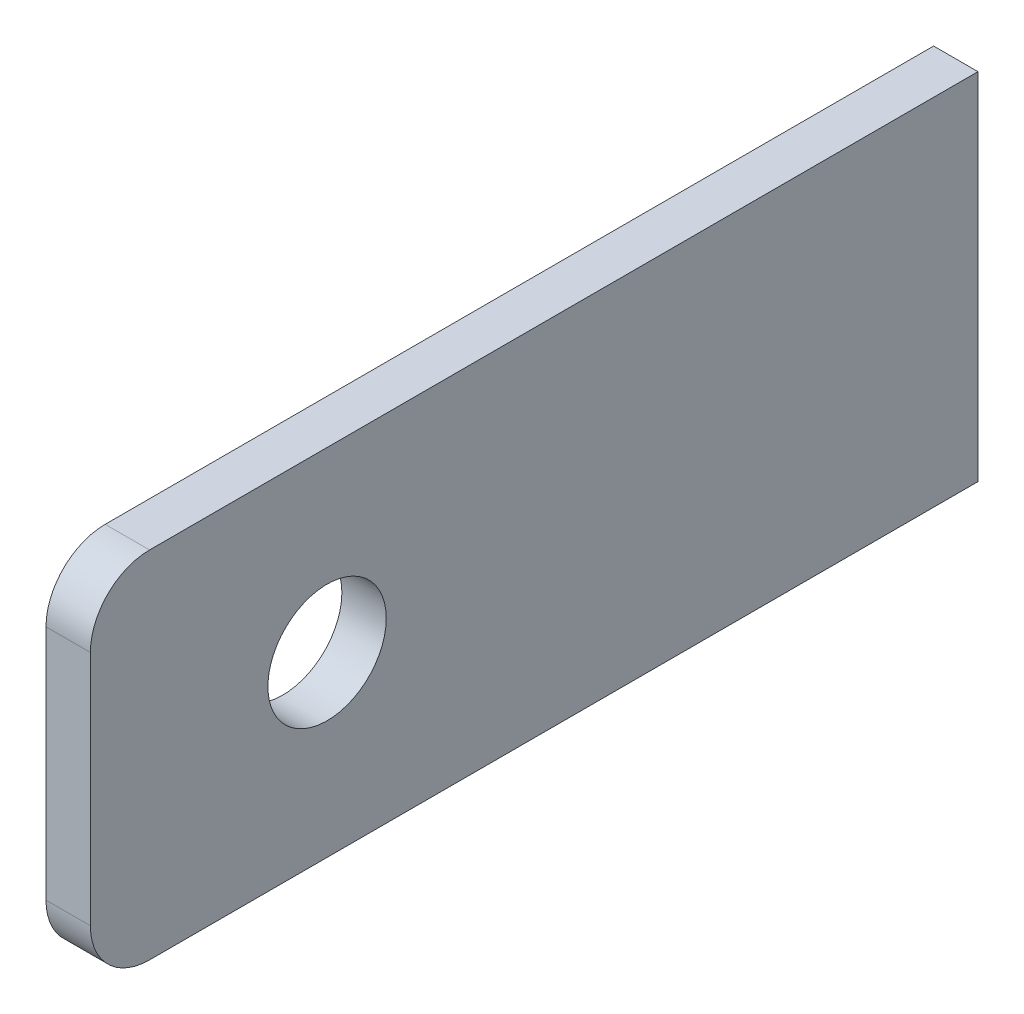
ISO-10303-21;
HEADER;
FILE_DESCRIPTION(('STEP AP214'),'2;1');
FILE_NAME('part.step','',(''),(''),'','','');
FILE_SCHEMA(('AUTOMOTIVE_DESIGN { 1 0 10303 214 1 1 1 1 }'));
ENDSEC;
DATA;
#1=APPLICATION_CONTEXT('core data for automotive mechanical design processes');
#2=APPLICATION_PROTOCOL_DEFINITION('international standard','automotive_design',2000,#1);
#3=PRODUCT_CONTEXT('',#1,'mechanical');
#4=PRODUCT('Part','Part','',(#3));
#5=PRODUCT_RELATED_PRODUCT_CATEGORY('part','',(#4));
#6=PRODUCT_DEFINITION_FORMATION('','',#4);
#7=PRODUCT_DEFINITION_CONTEXT('part definition',#1,'design');
#8=PRODUCT_DEFINITION('design','',#6,#7);
#9=PRODUCT_DEFINITION_SHAPE('','',#8);
#10=(LENGTH_UNIT() NAMED_UNIT(*) SI_UNIT(.MILLI.,.METRE.));
#11=(NAMED_UNIT(*) PLANE_ANGLE_UNIT() SI_UNIT($,.RADIAN.));
#12=(NAMED_UNIT(*) SI_UNIT($,.STERADIAN.) SOLID_ANGLE_UNIT());
#13=UNCERTAINTY_MEASURE_WITH_UNIT(LENGTH_MEASURE(1.E-05),#10,'distance_accuracy_value','');
#14=(GEOMETRIC_REPRESENTATION_CONTEXT(3) GLOBAL_UNCERTAINTY_ASSIGNED_CONTEXT((#13)) GLOBAL_UNIT_ASSIGNED_CONTEXT((#10,
#11,#12)) REPRESENTATION_CONTEXT('',''));
#15=CARTESIAN_POINT('',(0.,0.,0.));
#16=DIRECTION('',(0.,0.,1.));
#17=DIRECTION('',(1.,0.,0.));
#18=AXIS2_PLACEMENT_3D('',#15,#16,#17);
#19=CARTESIAN_POINT('',(7.5,60.,-150.));
#20=DIRECTION('',(0.,0.,1.));
#21=DIRECTION('',(1.,0.,0.));
#22=AXIS2_PLACEMENT_3D('',#19,#20,#21);
#23=PLANE('',#22);
#24=DIRECTION('',(0.,1.,0.));
#25=VECTOR('',#24,1.);
#26=CARTESIAN_POINT('',(-7.5,60.,-150.));
#27=LINE('',#26,#25);
#28=CARTESIAN_POINT('',(-7.5,-60.,-150.));
#29=VERTEX_POINT('',#28);
#30=CARTESIAN_POINT('',(-7.5,60.,-150.));
#31=VERTEX_POINT('',#30);
#32=EDGE_CURVE('E93',#29,#31,#27,.T.);
#33=ORIENTED_EDGE('',*,*,#32,.T.);
#34=DIRECTION('',(-1.,0.,0.));
#35=VECTOR('',#34,1.);
#36=CARTESIAN_POINT('',(7.5,60.,-150.));
#37=LINE('',#36,#35);
#38=CARTESIAN_POINT('',(7.5,60.,-150.));
#39=VERTEX_POINT('',#38);
#40=EDGE_CURVE('E74',#39,#31,#37,.T.);
#41=ORIENTED_EDGE('',*,*,#40,.F.);
#42=DIRECTION('',(0.,1.,0.));
#43=VECTOR('',#42,1.);
#44=CARTESIAN_POINT('',(7.5,60.,-150.));
#45=LINE('',#44,#43);
#46=CARTESIAN_POINT('',(7.5,-60.,-150.));
#47=VERTEX_POINT('',#46);
#48=EDGE_CURVE('E80',#47,#39,#45,.T.);
#49=ORIENTED_EDGE('',*,*,#48,.F.);
#50=DIRECTION('',(-1.,0.,0.));
#51=VECTOR('',#50,1.);
#52=CARTESIAN_POINT('',(7.5,-60.,-150.));
#53=LINE('',#52,#51);
#54=EDGE_CURVE('E96',#47,#29,#53,.T.);
#55=ORIENTED_EDGE('',*,*,#54,.T.);
#56=EDGE_LOOP('',(#33,#41,#49,#55));
#57=FACE_BOUND('',#56,.T.);
#58=ADVANCED_FACE('F17',(#57),#23,.F.);
#59=CARTESIAN_POINT('',(7.5,60.,150.));
#60=DIRECTION('',(0.,-1.,0.));
#61=DIRECTION('',(0.,0.,-1.));
#62=AXIS2_PLACEMENT_3D('',#59,#60,#61);
#63=PLANE('',#62);
#64=DIRECTION('',(0.,0.,1.));
#65=VECTOR('',#64,1.);
#66=CARTESIAN_POINT('',(-7.5,60.,150.));
#67=LINE('',#66,#65);
#68=CARTESIAN_POINT('',(-7.5,60.,130.));
#69=VERTEX_POINT('',#68);
#70=EDGE_CURVE('E134',#31,#69,#67,.T.);
#71=ORIENTED_EDGE('',*,*,#70,.T.);
#72=DIRECTION('',(-1.,0.,0.));
#73=VECTOR('',#72,1.);
#74=CARTESIAN_POINT('',(7.5,60.,130.));
#75=LINE('',#74,#73);
#76=CARTESIAN_POINT('',(7.5,60.,130.));
#77=VERTEX_POINT('',#76);
#78=EDGE_CURVE('E11',#69,#77,#75,.F.);
#79=ORIENTED_EDGE('',*,*,#78,.T.);
#80=DIRECTION('',(0.,0.,1.));
#81=VECTOR('',#80,1.);
#82=CARTESIAN_POINT('',(7.5,60.,150.));
#83=LINE('',#82,#81);
#84=EDGE_CURVE('E70',#39,#77,#83,.T.);
#85=ORIENTED_EDGE('',*,*,#84,.F.);
#86=ORIENTED_EDGE('',*,*,#40,.T.);
#87=EDGE_LOOP('',(#71,#79,#85,#86));
#88=FACE_BOUND('',#87,.T.);
#89=ADVANCED_FACE('F72',(#88),#63,.F.);
#90=CARTESIAN_POINT('',(7.5,60.,150.));
#91=DIRECTION('',(0.,0.,-1.));
#92=DIRECTION('',(0.,1.,0.));
#93=AXIS2_PLACEMENT_3D('',#90,#91,#92);
#94=PLANE('',#93);
#95=DIRECTION('',(0.,-1.,0.));
#96=VECTOR('',#95,1.);
#97=CARTESIAN_POINT('',(-7.5,60.,150.));
#98=LINE('',#97,#96);
#99=CARTESIAN_POINT('',(-7.5,40.,150.));
#100=VERTEX_POINT('',#99);
#101=CARTESIAN_POINT('',(-7.5,-40.,150.));
#102=VERTEX_POINT('',#101);
#103=EDGE_CURVE('E130',#100,#102,#98,.T.);
#104=ORIENTED_EDGE('',*,*,#103,.T.);
#105=DIRECTION('',(-1.,0.,0.));
#106=VECTOR('',#105,1.);
#107=CARTESIAN_POINT('',(7.5,-40.,150.));
#108=LINE('',#107,#106);
#109=CARTESIAN_POINT('',(7.5,-40.,150.));
#110=VERTEX_POINT('',#109);
#111=EDGE_CURVE('E39',#102,#110,#108,.F.);
#112=ORIENTED_EDGE('',*,*,#111,.T.);
#113=DIRECTION('',(0.,-1.,0.));
#114=VECTOR('',#113,1.);
#115=CARTESIAN_POINT('',(7.5,60.,150.));
#116=LINE('',#115,#114);
#117=CARTESIAN_POINT('',(7.5,40.,150.));
#118=VERTEX_POINT('',#117);
#119=EDGE_CURVE('E79',#118,#110,#116,.T.);
#120=ORIENTED_EDGE('',*,*,#119,.F.);
#121=DIRECTION('',(-1.,0.,0.));
#122=VECTOR('',#121,1.);
#123=CARTESIAN_POINT('',(7.5,40.,150.));
#124=LINE('',#123,#122);
#125=EDGE_CURVE('E112',#118,#100,#124,.T.);
#126=ORIENTED_EDGE('',*,*,#125,.T.);
#127=EDGE_LOOP('',(#104,#112,#120,#126));
#128=FACE_BOUND('',#127,.T.);
#129=ADVANCED_FACE('F131',(#128),#94,.F.);
#130=CARTESIAN_POINT('',(7.5,-60.,150.));
#131=DIRECTION('',(0.,1.,0.));
#132=DIRECTION('',(0.,0.,1.));
#133=AXIS2_PLACEMENT_3D('',#130,#131,#132);
#134=PLANE('',#133);
#135=DIRECTION('',(0.,0.,-1.));
#136=VECTOR('',#135,1.);
#137=CARTESIAN_POINT('',(7.5,-60.,150.));
#138=LINE('',#137,#136);
#139=CARTESIAN_POINT('',(7.5,-60.,130.));
#140=VERTEX_POINT('',#139);
#141=EDGE_CURVE('E85',#140,#47,#138,.T.);
#142=ORIENTED_EDGE('',*,*,#141,.F.);
#143=DIRECTION('',(-1.,0.,0.));
#144=VECTOR('',#143,1.);
#145=CARTESIAN_POINT('',(7.5,-60.,130.));
#146=LINE('',#145,#144);
#147=CARTESIAN_POINT('',(-7.5,-60.,130.));
#148=VERTEX_POINT('',#147);
#149=EDGE_CURVE('E95',#140,#148,#146,.T.);
#150=ORIENTED_EDGE('',*,*,#149,.T.);
#151=DIRECTION('',(0.,0.,-1.));
#152=VECTOR('',#151,1.);
#153=CARTESIAN_POINT('',(-7.5,-60.,150.));
#154=LINE('',#153,#152);
#155=EDGE_CURVE('E90',#148,#29,#154,.T.);
#156=ORIENTED_EDGE('',*,*,#155,.T.);
#157=ORIENTED_EDGE('',*,*,#54,.F.);
#158=EDGE_LOOP('',(#142,#150,#156,#157));
#159=FACE_BOUND('',#158,.T.);
#160=ADVANCED_FACE('F122',(#159),#134,.F.);
#161=CARTESIAN_POINT('',(7.5,0.,0.));
#162=DIRECTION('',(1.,0.,0.));
#163=DIRECTION('',(0.,0.,-1.));
#164=AXIS2_PLACEMENT_3D('',#161,#162,#163);
#165=PLANE('',#164);
#166=CARTESIAN_POINT('',(7.5,0.,70.));
#167=DIRECTION('',(1.,0.,0.));
#168=DIRECTION('',(0.,0.,-1.));
#169=AXIS2_PLACEMENT_3D('',#166,#167,#168);
#170=CIRCLE('',#169,20.);
#171=CARTESIAN_POINT('',(7.5,0.,50.));
#172=VERTEX_POINT('',#171);
#173=EDGE_CURVE('E144',#172,#172,#170,.T.);
#174=ORIENTED_EDGE('',*,*,#173,.F.);
#175=EDGE_LOOP('',(#174));
#176=FACE_BOUND('',#175,.T.);
#177=ORIENTED_EDGE('',*,*,#119,.T.);
#178=CARTESIAN_POINT('',(7.5,-40.,130.));
#179=DIRECTION('',(1.,0.,0.));
#180=DIRECTION('',(0.,0.,-1.));
#181=AXIS2_PLACEMENT_3D('',#178,#179,#180);
#182=CIRCLE('',#181,20.);
#183=EDGE_CURVE('E26',#110,#140,#182,.T.);
#184=ORIENTED_EDGE('',*,*,#183,.T.);
#185=ORIENTED_EDGE('',*,*,#141,.T.);
#186=ORIENTED_EDGE('',*,*,#48,.T.);
#187=ORIENTED_EDGE('',*,*,#84,.T.);
#188=CARTESIAN_POINT('',(7.5,40.,130.));
#189=DIRECTION('',(1.,0.,0.));
#190=DIRECTION('',(0.,0.,-1.));
#191=AXIS2_PLACEMENT_3D('',#188,#189,#190);
#192=CIRCLE('',#191,20.);
#193=EDGE_CURVE('E116',#77,#118,#192,.T.);
#194=ORIENTED_EDGE('',*,*,#193,.T.);
#195=EDGE_LOOP('',(#177,#184,#185,#186,#187,#194));
#196=FACE_BOUND('',#195,.T.);
#197=ADVANCED_FACE('F83',(#176,#196),#165,.T.);
#198=CARTESIAN_POINT('',(-7.5,0.,0.));
#199=DIRECTION('',(1.,0.,0.));
#200=DIRECTION('',(0.,0.,-1.));
#201=AXIS2_PLACEMENT_3D('',#198,#199,#200);
#202=PLANE('',#201);
#203=CARTESIAN_POINT('',(-7.5,0.,70.));
#204=DIRECTION('',(1.,0.,0.));
#205=DIRECTION('',(0.,0.,-1.));
#206=AXIS2_PLACEMENT_3D('',#203,#204,#205);
#207=CIRCLE('',#206,20.);
#208=CARTESIAN_POINT('',(-7.5,0.,50.));
#209=VERTEX_POINT('',#208);
#210=EDGE_CURVE('E141',#209,#209,#207,.T.);
#211=ORIENTED_EDGE('',*,*,#210,.T.);
#212=EDGE_LOOP('',(#211));
#213=FACE_BOUND('',#212,.T.);
#214=ORIENTED_EDGE('',*,*,#155,.F.);
#215=CARTESIAN_POINT('',(-7.5,-40.,130.));
#216=DIRECTION('',(1.,0.,0.));
#217=DIRECTION('',(0.,0.,-1.));
#218=AXIS2_PLACEMENT_3D('',#215,#216,#217);
#219=CIRCLE('',#218,20.);
#220=EDGE_CURVE('E110',#148,#102,#219,.F.);
#221=ORIENTED_EDGE('',*,*,#220,.T.);
#222=ORIENTED_EDGE('',*,*,#103,.F.);
#223=CARTESIAN_POINT('',(-7.5,40.,130.));
#224=DIRECTION('',(1.,0.,0.));
#225=DIRECTION('',(0.,0.,-1.));
#226=AXIS2_PLACEMENT_3D('',#223,#224,#225);
#227=CIRCLE('',#226,20.);
#228=EDGE_CURVE('E102',#100,#69,#227,.F.);
#229=ORIENTED_EDGE('',*,*,#228,.T.);
#230=ORIENTED_EDGE('',*,*,#70,.F.);
#231=ORIENTED_EDGE('',*,*,#32,.F.);
#232=EDGE_LOOP('',(#214,#221,#222,#229,#230,#231));
#233=FACE_BOUND('',#232,.T.);
#234=ADVANCED_FACE('F129',(#213,#233),#202,.F.);
#235=CARTESIAN_POINT('',(-7.5,0.,70.));
#236=DIRECTION('',(1.,0.,0.));
#237=DIRECTION('',(0.,0.,-1.));
#238=AXIS2_PLACEMENT_3D('',#235,#236,#237);
#239=CYLINDRICAL_SURFACE('',#238,20.);
#240=ORIENTED_EDGE('',*,*,#210,.F.);
#241=EDGE_LOOP('',(#240));
#242=FACE_BOUND('',#241,.T.);
#243=ORIENTED_EDGE('',*,*,#173,.T.);
#244=EDGE_LOOP('',(#243));
#245=FACE_BOUND('',#244,.T.);
#246=ADVANCED_FACE('F154',(#242,#245),#239,.F.);
#247=CARTESIAN_POINT('',(7.5,-40.,130.));
#248=DIRECTION('',(-1.,0.,0.));
#249=DIRECTION('',(0.,0.,1.));
#250=AXIS2_PLACEMENT_3D('',#247,#248,#249);
#251=CYLINDRICAL_SURFACE('',#250,20.);
#252=ORIENTED_EDGE('',*,*,#183,.F.);
#253=ORIENTED_EDGE('',*,*,#111,.F.);
#254=ORIENTED_EDGE('',*,*,#220,.F.);
#255=ORIENTED_EDGE('',*,*,#149,.F.);
#256=EDGE_LOOP('',(#252,#253,#254,#255));
#257=FACE_BOUND('',#256,.T.);
#258=ADVANCED_FACE('F126',(#257),#251,.T.);
#259=CARTESIAN_POINT('',(7.5,40.,130.));
#260=DIRECTION('',(-1.,0.,0.));
#261=DIRECTION('',(0.,0.,1.));
#262=AXIS2_PLACEMENT_3D('',#259,#260,#261);
#263=CYLINDRICAL_SURFACE('',#262,20.);
#264=ORIENTED_EDGE('',*,*,#193,.F.);
#265=ORIENTED_EDGE('',*,*,#78,.F.);
#266=ORIENTED_EDGE('',*,*,#228,.F.);
#267=ORIENTED_EDGE('',*,*,#125,.F.);
#268=EDGE_LOOP('',(#264,#265,#266,#267));
#269=FACE_BOUND('',#268,.T.);
#270=ADVANCED_FACE('F19',(#269),#263,.T.);
#271=CLOSED_SHELL('',(#58,#89,#129,#160,#197,#234,#246,#258,#270));
#272=MANIFOLD_SOLID_BREP('B1',#271);
#273=ADVANCED_BREP_SHAPE_REPRESENTATION('',(#18,#272),#14);
#274=SHAPE_DEFINITION_REPRESENTATION(#9,#273);
ENDSEC;
END-ISO-10303-21;
